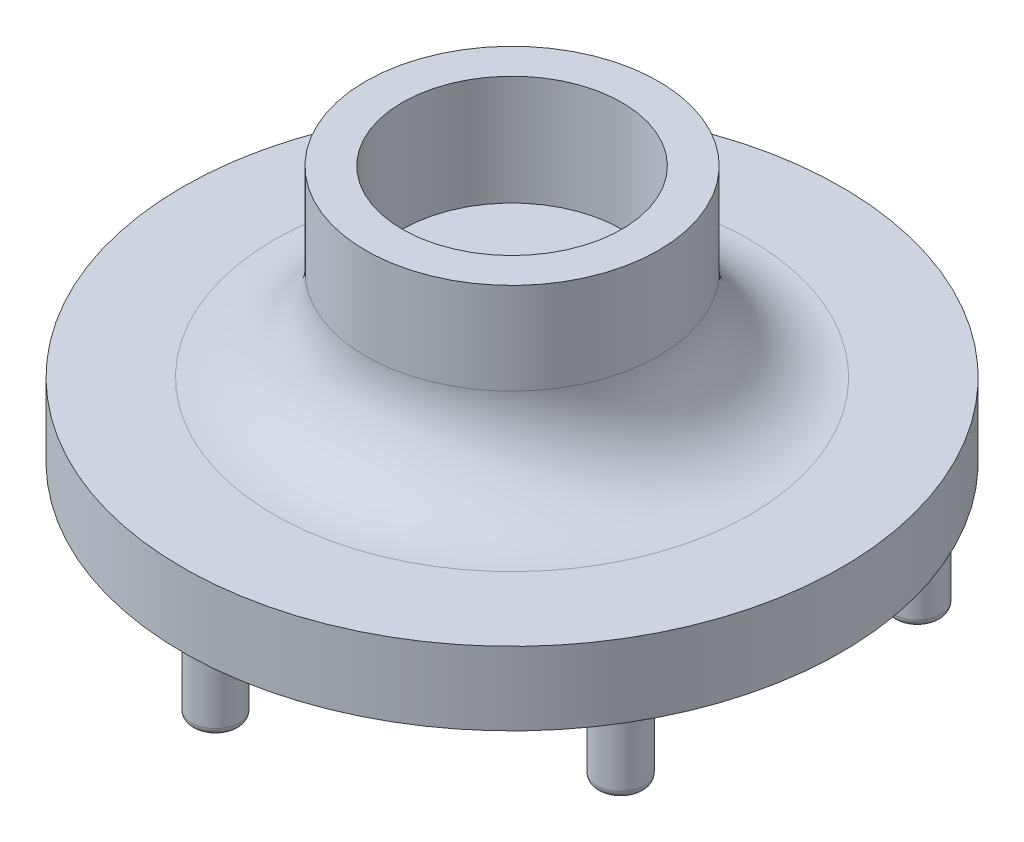
ISO-10303-21;
HEADER;
FILE_DESCRIPTION(('STEP AP214'),'2;1');
FILE_NAME('part.step','',(''),(''),'','','');
FILE_SCHEMA(('AUTOMOTIVE_DESIGN { 1 0 10303 214 1 1 1 1 }'));
ENDSEC;
DATA;
#1=APPLICATION_CONTEXT('core data for automotive mechanical design processes');
#2=APPLICATION_PROTOCOL_DEFINITION('international standard','automotive_design',2000,#1);
#3=PRODUCT_CONTEXT('',#1,'mechanical');
#4=PRODUCT('Part','Part','',(#3));
#5=PRODUCT_RELATED_PRODUCT_CATEGORY('part','',(#4));
#6=PRODUCT_DEFINITION_FORMATION('','',#4);
#7=PRODUCT_DEFINITION_CONTEXT('part definition',#1,'design');
#8=PRODUCT_DEFINITION('design','',#6,#7);
#9=PRODUCT_DEFINITION_SHAPE('','',#8);
#10=(LENGTH_UNIT() NAMED_UNIT(*) SI_UNIT(.MILLI.,.METRE.));
#11=(NAMED_UNIT(*) PLANE_ANGLE_UNIT() SI_UNIT($,.RADIAN.));
#12=(NAMED_UNIT(*) SI_UNIT($,.STERADIAN.) SOLID_ANGLE_UNIT());
#13=UNCERTAINTY_MEASURE_WITH_UNIT(LENGTH_MEASURE(1.E-05),#10,'distance_accuracy_value','');
#14=(GEOMETRIC_REPRESENTATION_CONTEXT(3) GLOBAL_UNCERTAINTY_ASSIGNED_CONTEXT((#13)) GLOBAL_UNIT_ASSIGNED_CONTEXT((#10,
#11,#12)) REPRESENTATION_CONTEXT('',''));
#15=CARTESIAN_POINT('',(0.,0.,0.));
#16=DIRECTION('',(0.,0.,1.));
#17=DIRECTION('',(1.,0.,0.));
#18=AXIS2_PLACEMENT_3D('',#15,#16,#17);
#19=CARTESIAN_POINT('',(0.,0.,0.));
#20=DIRECTION('',(0.,1.,0.));
#21=DIRECTION('',(-1.,0.,0.));
#22=AXIS2_PLACEMENT_3D('',#19,#20,#21);
#23=PLANE('',#22);
#24=CARTESIAN_POINT('',(0.,0.,0.));
#25=DIRECTION('',(0.,1.,0.));
#26=DIRECTION('',(-1.,0.,0.));
#27=AXIS2_PLACEMENT_3D('',#24,#25,#26);
#28=CIRCLE('',#27,16.1432512575363);
#29=CARTESIAN_POINT('',(-16.1432512575363,0.,0.));
#30=VERTEX_POINT('',#29);
#31=EDGE_CURVE('E99',#30,#30,#28,.F.);
#32=ORIENTED_EDGE('',*,*,#31,.T.);
#33=EDGE_LOOP('',(#32));
#34=FACE_BOUND('',#33,.T.);
#35=ADVANCED_FACE('F43',(#34),#23,.F.);
#36=CARTESIAN_POINT('',(0.,75.,0.));
#37=DIRECTION('',(0.,1.,0.));
#38=DIRECTION('',(-1.,0.,0.));
#39=AXIS2_PLACEMENT_3D('',#36,#37,#38);
#40=CYLINDRICAL_SURFACE('',#39,50.);
#41=CARTESIAN_POINT('',(0.,35.,0.));
#42=DIRECTION('',(0.,1.,0.));
#43=DIRECTION('',(-1.,0.,0.));
#44=AXIS2_PLACEMENT_3D('',#41,#42,#43);
#45=CIRCLE('',#44,50.);
#46=CARTESIAN_POINT('',(-50.,35.,0.));
#47=VERTEX_POINT('',#46);
#48=EDGE_CURVE('E135',#47,#47,#45,.T.);
#49=ORIENTED_EDGE('',*,*,#48,.F.);
#50=EDGE_LOOP('',(#49));
#51=FACE_BOUND('',#50,.T.);
#52=CARTESIAN_POINT('',(0.,30.,0.));
#53=DIRECTION('',(0.,1.,0.));
#54=DIRECTION('',(-1.,0.,0.));
#55=AXIS2_PLACEMENT_3D('',#52,#53,#54);
#56=CIRCLE('',#55,50.);
#57=CARTESIAN_POINT('',(-50.,30.,0.));
#58=VERTEX_POINT('',#57);
#59=EDGE_CURVE('E139',#58,#58,#56,.T.);
#60=ORIENTED_EDGE('',*,*,#59,.T.);
#61=EDGE_LOOP('',(#60));
#62=FACE_BOUND('',#61,.T.);
#63=ADVANCED_FACE('F186',(#51,#62),#40,.T.);
#64=CARTESIAN_POINT('',(0.,35.,0.));
#65=DIRECTION('',(0.,1.,0.));
#66=DIRECTION('',(-1.,0.,0.));
#67=AXIS2_PLACEMENT_3D('',#64,#65,#66);
#68=PLANE('',#67);
#69=CARTESIAN_POINT('',(70.1480577065391,35.,-40.5000000000008));
#70=DIRECTION('',(0.,1.,0.));
#71=DIRECTION('',(-1.,0.,0.));
#72=AXIS2_PLACEMENT_3D('',#69,#70,#71);
#73=CIRCLE('',#72,6.5);
#74=CARTESIAN_POINT('',(63.6480577065391,35.,-40.5000000000008));
#75=VERTEX_POINT('',#74);
#76=EDGE_CURVE('E163',#75,#75,#73,.T.);
#77=ORIENTED_EDGE('',*,*,#76,.T.);
#78=EDGE_LOOP('',(#77));
#79=FACE_BOUND('',#78,.T.);
#80=CARTESIAN_POINT('',(70.1480577065399,35.,40.4999999999993));
#81=DIRECTION('',(0.,1.,0.));
#82=DIRECTION('',(-1.,0.,0.));
#83=AXIS2_PLACEMENT_3D('',#80,#81,#82);
#84=CIRCLE('',#83,6.5);
#85=CARTESIAN_POINT('',(63.6480577065399,35.,40.4999999999993));
#86=VERTEX_POINT('',#85);
#87=EDGE_CURVE('E159',#86,#86,#84,.T.);
#88=ORIENTED_EDGE('',*,*,#87,.T.);
#89=EDGE_LOOP('',(#88));
#90=FACE_BOUND('',#89,.T.);
#91=CARTESIAN_POINT('',(0.,35.,81.));
#92=DIRECTION('',(0.,1.,0.));
#93=DIRECTION('',(-1.,0.,0.));
#94=AXIS2_PLACEMENT_3D('',#91,#92,#93);
#95=CIRCLE('',#94,6.5);
#96=CARTESIAN_POINT('',(-6.5,35.,81.));
#97=VERTEX_POINT('',#96);
#98=EDGE_CURVE('E155',#97,#97,#95,.T.);
#99=ORIENTED_EDGE('',*,*,#98,.T.);
#100=EDGE_LOOP('',(#99));
#101=FACE_BOUND('',#100,.T.);
#102=CARTESIAN_POINT('',(-70.1480577065393,35.,40.5000000000003));
#103=DIRECTION('',(0.,1.,0.));
#104=DIRECTION('',(-1.,0.,0.));
#105=AXIS2_PLACEMENT_3D('',#102,#103,#104);
#106=CIRCLE('',#105,6.5);
#107=CARTESIAN_POINT('',(-76.6480577065394,35.,40.5000000000003));
#108=VERTEX_POINT('',#107);
#109=EDGE_CURVE('E151',#108,#108,#106,.T.);
#110=ORIENTED_EDGE('',*,*,#109,.T.);
#111=EDGE_LOOP('',(#110));
#112=FACE_BOUND('',#111,.T.);
#113=CARTESIAN_POINT('',(-70.1480577065396,35.,-40.4999999999998));
#114=DIRECTION('',(0.,1.,0.));
#115=DIRECTION('',(-1.,0.,0.));
#116=AXIS2_PLACEMENT_3D('',#113,#114,#115);
#117=CIRCLE('',#116,6.5);
#118=CARTESIAN_POINT('',(-76.6480577065396,35.,-40.4999999999998));
#119=VERTEX_POINT('',#118);
#120=EDGE_CURVE('E147',#119,#119,#117,.T.);
#121=ORIENTED_EDGE('',*,*,#120,.T.);
#122=EDGE_LOOP('',(#121));
#123=FACE_BOUND('',#122,.T.);
#124=CARTESIAN_POINT('',(0.,35.,-81.));
#125=DIRECTION('',(0.,1.,0.));
#126=DIRECTION('',(-1.,0.,0.));
#127=AXIS2_PLACEMENT_3D('',#124,#125,#126);
#128=CIRCLE('',#127,6.5);
#129=CARTESIAN_POINT('',(-6.5,35.,-81.));
#130=VERTEX_POINT('',#129);
#131=EDGE_CURVE('E143',#130,#130,#128,.T.);
#132=ORIENTED_EDGE('',*,*,#131,.T.);
#133=EDGE_LOOP('',(#132));
#134=FACE_BOUND('',#133,.T.);
#135=CARTESIAN_POINT('',(0.,35.,0.));
#136=DIRECTION('',(0.,1.,0.));
#137=DIRECTION('',(-1.,0.,0.));
#138=AXIS2_PLACEMENT_3D('',#135,#136,#137);
#139=CIRCLE('',#138,90.);
#140=CARTESIAN_POINT('',(-90.,35.,0.));
#141=VERTEX_POINT('',#140);
#142=EDGE_CURVE('E131',#141,#141,#139,.T.);
#143=ORIENTED_EDGE('',*,*,#142,.F.);
#144=EDGE_LOOP('',(#143));
#145=FACE_BOUND('',#144,.T.);
#146=ORIENTED_EDGE('',*,*,#48,.T.);
#147=EDGE_LOOP('',(#146));
#148=FACE_BOUND('',#147,.T.);
#149=ADVANCED_FACE('F168',(#79,#90,#101,#112,#123,#134,#145,#148),#68,.F.);
#150=CARTESIAN_POINT('',(0.,75.,0.));
#151=DIRECTION('',(0.,1.,0.));
#152=DIRECTION('',(-1.,0.,0.));
#153=AXIS2_PLACEMENT_3D('',#150,#151,#152);
#154=CYLINDRICAL_SURFACE('',#153,90.);
#155=CARTESIAN_POINT('',(0.,55.,0.));
#156=DIRECTION('',(0.,1.,0.));
#157=DIRECTION('',(-1.,0.,0.));
#158=AXIS2_PLACEMENT_3D('',#155,#156,#157);
#159=CIRCLE('',#158,90.);
#160=CARTESIAN_POINT('',(-90.,55.,0.));
#161=VERTEX_POINT('',#160);
#162=EDGE_CURVE('E127',#161,#161,#159,.T.);
#163=ORIENTED_EDGE('',*,*,#162,.F.);
#164=EDGE_LOOP('',(#163));
#165=FACE_BOUND('',#164,.T.);
#166=ORIENTED_EDGE('',*,*,#142,.T.);
#167=EDGE_LOOP('',(#166));
#168=FACE_BOUND('',#167,.T.);
#169=ADVANCED_FACE('F200',(#165,#168),#154,.T.);
#170=CARTESIAN_POINT('',(0.,55.,0.));
#171=DIRECTION('',(0.,-1.,0.));
#172=DIRECTION('',(1.,0.,0.));
#173=AXIS2_PLACEMENT_3D('',#170,#171,#172);
#174=PLANE('',#173);
#175=CARTESIAN_POINT('',(0.,55.,0.));
#176=DIRECTION('',(0.,-1.,0.));
#177=DIRECTION('',(1.,0.,0.));
#178=AXIS2_PLACEMENT_3D('',#175,#176,#177);
#179=CIRCLE('',#178,65.);
#180=CARTESIAN_POINT('',(65.,55.,0.));
#181=VERTEX_POINT('',#180);
#182=EDGE_CURVE('E107',#181,#181,#179,.T.);
#183=ORIENTED_EDGE('',*,*,#182,.T.);
#184=EDGE_LOOP('',(#183));
#185=FACE_BOUND('',#184,.T.);
#186=ORIENTED_EDGE('',*,*,#162,.T.);
#187=EDGE_LOOP('',(#186));
#188=FACE_BOUND('',#187,.T.);
#189=ADVANCED_FACE('F203',(#185,#188),#174,.F.);
#190=CARTESIAN_POINT('',(0.,75.,0.));
#191=DIRECTION('',(0.,1.,0.));
#192=DIRECTION('',(-1.,0.,0.));
#193=AXIS2_PLACEMENT_3D('',#190,#191,#192);
#194=CYLINDRICAL_SURFACE('',#193,40.);
#195=CARTESIAN_POINT('',(0.,80.,0.));
#196=DIRECTION('',(0.,-1.,0.));
#197=DIRECTION('',(1.,0.,0.));
#198=AXIS2_PLACEMENT_3D('',#195,#196,#197);
#199=CIRCLE('',#198,40.);
#200=CARTESIAN_POINT('',(40.,80.,0.));
#201=VERTEX_POINT('',#200);
#202=EDGE_CURVE('E111',#201,#201,#199,.F.);
#203=ORIENTED_EDGE('',*,*,#202,.T.);
#204=EDGE_LOOP('',(#203));
#205=FACE_BOUND('',#204,.T.);
#206=CARTESIAN_POINT('',(0.,105.,0.));
#207=DIRECTION('',(0.,1.,0.));
#208=DIRECTION('',(-1.,0.,0.));
#209=AXIS2_PLACEMENT_3D('',#206,#207,#208);
#210=CIRCLE('',#209,40.);
#211=CARTESIAN_POINT('',(-40.,105.,0.));
#212=VERTEX_POINT('',#211);
#213=EDGE_CURVE('E123',#212,#212,#210,.T.);
#214=ORIENTED_EDGE('',*,*,#213,.F.);
#215=EDGE_LOOP('',(#214));
#216=FACE_BOUND('',#215,.T.);
#217=ADVANCED_FACE('F207',(#205,#216),#194,.T.);
#218=CARTESIAN_POINT('',(0.,105.,0.));
#219=DIRECTION('',(0.,-1.,0.));
#220=DIRECTION('',(1.,0.,0.));
#221=AXIS2_PLACEMENT_3D('',#218,#219,#220);
#222=PLANE('',#221);
#223=CARTESIAN_POINT('',(0.,105.,0.));
#224=DIRECTION('',(0.,1.,0.));
#225=DIRECTION('',(-1.,0.,0.));
#226=AXIS2_PLACEMENT_3D('',#223,#224,#225);
#227=CIRCLE('',#226,30.);
#228=CARTESIAN_POINT('',(-30.,105.,0.));
#229=VERTEX_POINT('',#228);
#230=EDGE_CURVE('E119',#229,#229,#227,.T.);
#231=ORIENTED_EDGE('',*,*,#230,.F.);
#232=EDGE_LOOP('',(#231));
#233=FACE_BOUND('',#232,.T.);
#234=ORIENTED_EDGE('',*,*,#213,.T.);
#235=EDGE_LOOP('',(#234));
#236=FACE_BOUND('',#235,.T.);
#237=ADVANCED_FACE('F211',(#233,#236),#222,.F.);
#238=CARTESIAN_POINT('',(0.,75.,0.));
#239=DIRECTION('',(0.,1.,0.));
#240=DIRECTION('',(-1.,0.,0.));
#241=AXIS2_PLACEMENT_3D('',#238,#239,#240);
#242=CYLINDRICAL_SURFACE('',#241,30.);
#243=CARTESIAN_POINT('',(0.,75.,0.));
#244=DIRECTION('',(0.,1.,0.));
#245=DIRECTION('',(-1.,0.,0.));
#246=AXIS2_PLACEMENT_3D('',#243,#244,#245);
#247=CIRCLE('',#246,30.);
#248=CARTESIAN_POINT('',(-30.,75.,0.));
#249=VERTEX_POINT('',#248);
#250=EDGE_CURVE('E115',#249,#249,#247,.T.);
#251=ORIENTED_EDGE('',*,*,#250,.F.);
#252=EDGE_LOOP('',(#251));
#253=FACE_BOUND('',#252,.T.);
#254=ORIENTED_EDGE('',*,*,#230,.T.);
#255=EDGE_LOOP('',(#254));
#256=FACE_BOUND('',#255,.T.);
#257=ADVANCED_FACE('F215',(#253,#256),#242,.F.);
#258=CARTESIAN_POINT('',(0.,75.,0.));
#259=DIRECTION('',(0.,-1.,0.));
#260=DIRECTION('',(1.,0.,0.));
#261=AXIS2_PLACEMENT_3D('',#258,#259,#260);
#262=PLANE('',#261);
#263=ORIENTED_EDGE('',*,*,#250,.T.);
#264=EDGE_LOOP('',(#263));
#265=FACE_BOUND('',#264,.T.);
#266=ADVANCED_FACE('F219',(#265),#262,.F.);
#267=CARTESIAN_POINT('',(0.,15.,-81.));
#268=DIRECTION('',(0.,1.,0.));
#269=DIRECTION('',(-1.,0.,0.));
#270=AXIS2_PLACEMENT_3D('',#267,#268,#269);
#271=CYLINDRICAL_SURFACE('',#270,6.5);
#272=CARTESIAN_POINT('',(0.,17.,-81.));
#273=DIRECTION('',(0.,1.,0.));
#274=DIRECTION('',(-1.,0.,0.));
#275=AXIS2_PLACEMENT_3D('',#272,#273,#274);
#276=CIRCLE('',#275,6.5);
#277=CARTESIAN_POINT('',(-6.5,17.,-81.));
#278=VERTEX_POINT('',#277);
#279=EDGE_CURVE('E61',#278,#278,#276,.T.);
#280=ORIENTED_EDGE('',*,*,#279,.T.);
#281=EDGE_LOOP('',(#280));
#282=FACE_BOUND('',#281,.T.);
#283=ORIENTED_EDGE('',*,*,#131,.F.);
#284=EDGE_LOOP('',(#283));
#285=FACE_BOUND('',#284,.T.);
#286=ADVANCED_FACE('F195',(#282,#285),#271,.T.);
#287=CARTESIAN_POINT('',(0.,15.,-81.));
#288=DIRECTION('',(0.,1.,0.));
#289=DIRECTION('',(-1.,0.,0.));
#290=AXIS2_PLACEMENT_3D('',#287,#288,#289);
#291=PLANE('',#290);
#292=CARTESIAN_POINT('',(0.,15.,-81.));
#293=DIRECTION('',(0.,1.,0.));
#294=DIRECTION('',(-1.,0.,0.));
#295=AXIS2_PLACEMENT_3D('',#292,#293,#294);
#296=CIRCLE('',#295,4.5);
#297=CARTESIAN_POINT('',(-4.5,15.,-81.));
#298=VERTEX_POINT('',#297);
#299=EDGE_CURVE('E56',#298,#298,#296,.F.);
#300=ORIENTED_EDGE('',*,*,#299,.T.);
#301=EDGE_LOOP('',(#300));
#302=FACE_BOUND('',#301,.T.);
#303=ADVANCED_FACE('F263',(#302),#291,.F.);
#304=CARTESIAN_POINT('',(-70.1480577065396,15.,-40.4999999999998));
#305=DIRECTION('',(0.,1.,0.));
#306=DIRECTION('',(-1.,0.,0.));
#307=AXIS2_PLACEMENT_3D('',#304,#305,#306);
#308=CYLINDRICAL_SURFACE('',#307,6.5);
#309=CARTESIAN_POINT('',(-70.1480577065396,17.,-40.4999999999998));
#310=DIRECTION('',(0.,1.,0.));
#311=DIRECTION('',(-1.,0.,0.));
#312=AXIS2_PLACEMENT_3D('',#309,#310,#311);
#313=CIRCLE('',#312,6.5);
#314=CARTESIAN_POINT('',(-76.6480577065396,17.,-40.4999999999998));
#315=VERTEX_POINT('',#314);
#316=EDGE_CURVE('E71',#315,#315,#313,.T.);
#317=ORIENTED_EDGE('',*,*,#316,.T.);
#318=EDGE_LOOP('',(#317));
#319=FACE_BOUND('',#318,.T.);
#320=ORIENTED_EDGE('',*,*,#120,.F.);
#321=EDGE_LOOP('',(#320));
#322=FACE_BOUND('',#321,.T.);
#323=ADVANCED_FACE('F277',(#319,#322),#308,.T.);
#324=CARTESIAN_POINT('',(-70.1480577065396,15.,-40.4999999999998));
#325=DIRECTION('',(0.,1.,0.));
#326=DIRECTION('',(-0.499999999999998,0.,0.86602540378444));
#327=AXIS2_PLACEMENT_3D('',#324,#325,#326);
#328=PLANE('',#327);
#329=CARTESIAN_POINT('',(-70.1480577065396,15.,-40.4999999999998));
#330=DIRECTION('',(0.,1.,0.));
#331=DIRECTION('',(-1.,0.,0.));
#332=AXIS2_PLACEMENT_3D('',#329,#330,#331);
#333=CIRCLE('',#332,4.5);
#334=CARTESIAN_POINT('',(-74.6480577065396,15.,-40.4999999999998));
#335=VERTEX_POINT('',#334);
#336=EDGE_CURVE('E67',#335,#335,#333,.F.);
#337=ORIENTED_EDGE('',*,*,#336,.T.);
#338=EDGE_LOOP('',(#337));
#339=FACE_BOUND('',#338,.T.);
#340=ADVANCED_FACE('F282',(#339),#328,.F.);
#341=CARTESIAN_POINT('',(-70.1480577065393,15.,40.5000000000003));
#342=DIRECTION('',(0.,1.,0.));
#343=DIRECTION('',(-1.,0.,0.));
#344=AXIS2_PLACEMENT_3D('',#341,#342,#343);
#345=CYLINDRICAL_SURFACE('',#344,6.5);
#346=CARTESIAN_POINT('',(-70.1480577065393,17.,40.5000000000003));
#347=DIRECTION('',(0.,1.,0.));
#348=DIRECTION('',(-1.,0.,0.));
#349=AXIS2_PLACEMENT_3D('',#346,#347,#348);
#350=CIRCLE('',#349,6.5);
#351=CARTESIAN_POINT('',(-76.6480577065394,17.,40.5000000000003));
#352=VERTEX_POINT('',#351);
#353=EDGE_CURVE('E79',#352,#352,#350,.T.);
#354=ORIENTED_EDGE('',*,*,#353,.T.);
#355=EDGE_LOOP('',(#354));
#356=FACE_BOUND('',#355,.T.);
#357=ORIENTED_EDGE('',*,*,#109,.F.);
#358=EDGE_LOOP('',(#357));
#359=FACE_BOUND('',#358,.T.);
#360=ADVANCED_FACE('F288',(#356,#359),#345,.T.);
#361=CARTESIAN_POINT('',(-70.1480577065393,15.,40.5000000000003));
#362=DIRECTION('',(0.,1.,0.));
#363=DIRECTION('',(0.500000000000004,0.,0.866025403784436));
#364=AXIS2_PLACEMENT_3D('',#361,#362,#363);
#365=PLANE('',#364);
#366=CARTESIAN_POINT('',(-70.1480577065393,15.,40.5000000000003));
#367=DIRECTION('',(0.,1.,0.));
#368=DIRECTION('',(-1.,0.,0.));
#369=AXIS2_PLACEMENT_3D('',#366,#367,#368);
#370=CIRCLE('',#369,4.5);
#371=CARTESIAN_POINT('',(-74.6480577065394,15.,40.5000000000003));
#372=VERTEX_POINT('',#371);
#373=EDGE_CURVE('E75',#372,#372,#370,.F.);
#374=ORIENTED_EDGE('',*,*,#373,.T.);
#375=EDGE_LOOP('',(#374));
#376=FACE_BOUND('',#375,.T.);
#377=ADVANCED_FACE('F292',(#376),#365,.F.);
#378=CARTESIAN_POINT('',(0.,15.,81.));
#379=DIRECTION('',(0.,1.,0.));
#380=DIRECTION('',(-1.,0.,0.));
#381=AXIS2_PLACEMENT_3D('',#378,#379,#380);
#382=CYLINDRICAL_SURFACE('',#381,6.5);
#383=CARTESIAN_POINT('',(0.,17.,81.));
#384=DIRECTION('',(0.,1.,0.));
#385=DIRECTION('',(-1.,0.,0.));
#386=AXIS2_PLACEMENT_3D('',#383,#384,#385);
#387=CIRCLE('',#386,6.5);
#388=CARTESIAN_POINT('',(-6.5,17.,81.));
#389=VERTEX_POINT('',#388);
#390=EDGE_CURVE('E87',#389,#389,#387,.T.);
#391=ORIENTED_EDGE('',*,*,#390,.T.);
#392=EDGE_LOOP('',(#391));
#393=FACE_BOUND('',#392,.T.);
#394=ORIENTED_EDGE('',*,*,#98,.F.);
#395=EDGE_LOOP('',(#394));
#396=FACE_BOUND('',#395,.T.);
#397=ADVANCED_FACE('F296',(#393,#396),#382,.T.);
#398=CARTESIAN_POINT('',(0.,15.,81.));
#399=DIRECTION('',(0.,1.,0.));
#400=DIRECTION('',(1.,0.,0.));
#401=AXIS2_PLACEMENT_3D('',#398,#399,#400);
#402=PLANE('',#401);
#403=CARTESIAN_POINT('',(0.,15.,81.));
#404=DIRECTION('',(0.,1.,0.));
#405=DIRECTION('',(-1.,0.,0.));
#406=AXIS2_PLACEMENT_3D('',#403,#404,#405);
#407=CIRCLE('',#406,4.5);
#408=CARTESIAN_POINT('',(-4.5,15.,81.));
#409=VERTEX_POINT('',#408);
#410=EDGE_CURVE('E83',#409,#409,#407,.F.);
#411=ORIENTED_EDGE('',*,*,#410,.T.);
#412=EDGE_LOOP('',(#411));
#413=FACE_BOUND('',#412,.T.);
#414=ADVANCED_FACE('F300',(#413),#402,.F.);
#415=CARTESIAN_POINT('',(70.1480577065399,15.,40.4999999999993));
#416=DIRECTION('',(0.,1.,0.));
#417=DIRECTION('',(-1.,0.,0.));
#418=AXIS2_PLACEMENT_3D('',#415,#416,#417);
#419=CYLINDRICAL_SURFACE('',#418,6.5);
#420=CARTESIAN_POINT('',(70.1480577065399,17.,40.4999999999993));
#421=DIRECTION('',(0.,1.,0.));
#422=DIRECTION('',(-1.,0.,0.));
#423=AXIS2_PLACEMENT_3D('',#420,#421,#422);
#424=CIRCLE('',#423,6.5);
#425=CARTESIAN_POINT('',(63.6480577065399,17.,40.4999999999993));
#426=VERTEX_POINT('',#425);
#427=EDGE_CURVE('E95',#426,#426,#424,.T.);
#428=ORIENTED_EDGE('',*,*,#427,.T.);
#429=EDGE_LOOP('',(#428));
#430=FACE_BOUND('',#429,.T.);
#431=ORIENTED_EDGE('',*,*,#87,.F.);
#432=EDGE_LOOP('',(#431));
#433=FACE_BOUND('',#432,.T.);
#434=ADVANCED_FACE('F182',(#430,#433),#419,.T.);
#435=CARTESIAN_POINT('',(70.1480577065399,15.,40.4999999999993));
#436=DIRECTION('',(0.,1.,0.));
#437=DIRECTION('',(0.499999999999992,0.,-0.866025403784443));
#438=AXIS2_PLACEMENT_3D('',#435,#436,#437);
#439=PLANE('',#438);
#440=CARTESIAN_POINT('',(70.1480577065399,15.,40.4999999999993));
#441=DIRECTION('',(0.,1.,0.));
#442=DIRECTION('',(-1.,0.,0.));
#443=AXIS2_PLACEMENT_3D('',#440,#441,#442);
#444=CIRCLE('',#443,4.5);
#445=CARTESIAN_POINT('',(65.6480577065399,15.,40.4999999999993));
#446=VERTEX_POINT('',#445);
#447=EDGE_CURVE('E91',#446,#446,#444,.F.);
#448=ORIENTED_EDGE('',*,*,#447,.T.);
#449=EDGE_LOOP('',(#448));
#450=FACE_BOUND('',#449,.T.);
#451=ADVANCED_FACE('F174',(#450),#439,.F.);
#452=CARTESIAN_POINT('',(70.1480577065391,15.,-40.5000000000008));
#453=DIRECTION('',(0.,1.,0.));
#454=DIRECTION('',(-1.,0.,0.));
#455=AXIS2_PLACEMENT_3D('',#452,#453,#454);
#456=CYLINDRICAL_SURFACE('',#455,6.5);
#457=CARTESIAN_POINT('',(70.1480577065391,17.,-40.5000000000008));
#458=DIRECTION('',(0.,1.,0.));
#459=DIRECTION('',(-1.,0.,0.));
#460=AXIS2_PLACEMENT_3D('',#457,#458,#459);
#461=CIRCLE('',#460,6.5);
#462=CARTESIAN_POINT('',(63.6480577065391,17.,-40.5000000000008));
#463=VERTEX_POINT('',#462);
#464=EDGE_CURVE('E51',#463,#463,#461,.T.);
#465=ORIENTED_EDGE('',*,*,#464,.T.);
#466=EDGE_LOOP('',(#465));
#467=FACE_BOUND('',#466,.T.);
#468=ORIENTED_EDGE('',*,*,#76,.F.);
#469=EDGE_LOOP('',(#468));
#470=FACE_BOUND('',#469,.T.);
#471=ADVANCED_FACE('F171',(#467,#470),#456,.T.);
#472=CARTESIAN_POINT('',(70.1480577065391,15.,-40.5000000000008));
#473=DIRECTION('',(0.,1.,0.));
#474=DIRECTION('',(-0.50000000000001,0.,-0.866025403784433));
#475=AXIS2_PLACEMENT_3D('',#472,#473,#474);
#476=PLANE('',#475);
#477=CARTESIAN_POINT('',(70.1480577065391,15.,-40.5000000000008));
#478=DIRECTION('',(0.,1.,0.));
#479=DIRECTION('',(-1.,0.,0.));
#480=AXIS2_PLACEMENT_3D('',#477,#478,#479);
#481=CIRCLE('',#480,4.5);
#482=CARTESIAN_POINT('',(65.6480577065391,15.,-40.5000000000008));
#483=VERTEX_POINT('',#482);
#484=EDGE_CURVE('E10',#483,#483,#481,.F.);
#485=ORIENTED_EDGE('',*,*,#484,.T.);
#486=EDGE_LOOP('',(#485));
#487=FACE_BOUND('',#486,.T.);
#488=ADVANCED_FACE('F173',(#487),#476,.F.);
#489=CARTESIAN_POINT('',(0.,80.,0.));
#490=DIRECTION('',(0.,-1.,0.));
#491=DIRECTION('',(1.,0.,0.));
#492=AXIS2_PLACEMENT_3D('',#489,#490,#491);
#493=TOROIDAL_SURFACE('',#492,65.,25.);
#494=ORIENTED_EDGE('',*,*,#182,.F.);
#495=EDGE_LOOP('',(#494));
#496=FACE_BOUND('',#495,.T.);
#497=ORIENTED_EDGE('',*,*,#202,.F.);
#498=EDGE_LOOP('',(#497));
#499=FACE_BOUND('',#498,.T.);
#500=ADVANCED_FACE('F180',(#496,#499),#493,.F.);
#501=CARTESIAN_POINT('',(0.,5.5051025721682,0.));
#502=DIRECTION('',(0.,1.,0.));
#503=DIRECTION('',(-1.,0.,0.));
#504=AXIS2_PLACEMENT_3D('',#501,#502,#503);
#505=TOROIDAL_SURFACE('',#504,55.,25.);
#506=CARTESIAN_POINT('',(0.,11.4394134645631,0.));
#507=DIRECTION('',(0.,-1.,0.));
#508=DIRECTION('',(1.,0.,0.));
#509=AXIS2_PLACEMENT_3D('',#506,#507,#508);
#510=CIRCLE('',#509,30.7145320359602);
#511=CARTESIAN_POINT('',(30.7145320359602,11.4394134645631,0.));
#512=VERTEX_POINT('',#511);
#513=EDGE_CURVE('E103',#512,#512,#510,.F.);
#514=ORIENTED_EDGE('',*,*,#513,.T.);
#515=EDGE_LOOP('',(#514));
#516=FACE_BOUND('',#515,.T.);
#517=ORIENTED_EDGE('',*,*,#59,.F.);
#518=EDGE_LOOP('',(#517));
#519=FACE_BOUND('',#518,.T.);
#520=ADVANCED_FACE('F226',(#516,#519),#505,.F.);
#521=CARTESIAN_POINT('',(0.,15.,0.));
#522=DIRECTION('',(0.,-1.,0.));
#523=DIRECTION('',(1.,0.,0.));
#524=AXIS2_PLACEMENT_3D('',#521,#522,#523);
#525=TOROIDAL_SURFACE('',#524,16.1432512575363,15.);
#526=ORIENTED_EDGE('',*,*,#31,.F.);
#527=EDGE_LOOP('',(#526));
#528=FACE_BOUND('',#527,.T.);
#529=ORIENTED_EDGE('',*,*,#513,.F.);
#530=EDGE_LOOP('',(#529));
#531=FACE_BOUND('',#530,.T.);
#532=ADVANCED_FACE('F230',(#528,#531),#525,.T.);
#533=CARTESIAN_POINT('',(70.1480577065399,17.,40.4999999999993));
#534=DIRECTION('',(0.,1.,0.));
#535=DIRECTION('',(-1.,0.,0.));
#536=AXIS2_PLACEMENT_3D('',#533,#534,#535);
#537=TOROIDAL_SURFACE('',#536,4.5,2.);
#538=ORIENTED_EDGE('',*,*,#447,.F.);
#539=EDGE_LOOP('',(#538));
#540=FACE_BOUND('',#539,.T.);
#541=ORIENTED_EDGE('',*,*,#427,.F.);
#542=EDGE_LOOP('',(#541));
#543=FACE_BOUND('',#542,.T.);
#544=ADVANCED_FACE('F234',(#540,#543),#537,.T.);
#545=CARTESIAN_POINT('',(0.,17.,81.));
#546=DIRECTION('',(0.,1.,0.));
#547=DIRECTION('',(-1.,0.,0.));
#548=AXIS2_PLACEMENT_3D('',#545,#546,#547);
#549=TOROIDAL_SURFACE('',#548,4.5,2.);
#550=ORIENTED_EDGE('',*,*,#410,.F.);
#551=EDGE_LOOP('',(#550));
#552=FACE_BOUND('',#551,.T.);
#553=ORIENTED_EDGE('',*,*,#390,.F.);
#554=EDGE_LOOP('',(#553));
#555=FACE_BOUND('',#554,.T.);
#556=ADVANCED_FACE('F238',(#552,#555),#549,.T.);
#557=CARTESIAN_POINT('',(-70.1480577065393,17.,40.5000000000003));
#558=DIRECTION('',(0.,1.,0.));
#559=DIRECTION('',(-1.,0.,0.));
#560=AXIS2_PLACEMENT_3D('',#557,#558,#559);
#561=TOROIDAL_SURFACE('',#560,4.5,2.);
#562=ORIENTED_EDGE('',*,*,#373,.F.);
#563=EDGE_LOOP('',(#562));
#564=FACE_BOUND('',#563,.T.);
#565=ORIENTED_EDGE('',*,*,#353,.F.);
#566=EDGE_LOOP('',(#565));
#567=FACE_BOUND('',#566,.T.);
#568=ADVANCED_FACE('F242',(#564,#567),#561,.T.);
#569=CARTESIAN_POINT('',(-70.1480577065396,17.,-40.4999999999998));
#570=DIRECTION('',(0.,1.,0.));
#571=DIRECTION('',(-1.,0.,0.));
#572=AXIS2_PLACEMENT_3D('',#569,#570,#571);
#573=TOROIDAL_SURFACE('',#572,4.5,2.);
#574=ORIENTED_EDGE('',*,*,#336,.F.);
#575=EDGE_LOOP('',(#574));
#576=FACE_BOUND('',#575,.T.);
#577=ORIENTED_EDGE('',*,*,#316,.F.);
#578=EDGE_LOOP('',(#577));
#579=FACE_BOUND('',#578,.T.);
#580=ADVANCED_FACE('F246',(#576,#579),#573,.T.);
#581=CARTESIAN_POINT('',(0.,17.,-81.));
#582=DIRECTION('',(0.,1.,0.));
#583=DIRECTION('',(-1.,0.,0.));
#584=AXIS2_PLACEMENT_3D('',#581,#582,#583);
#585=TOROIDAL_SURFACE('',#584,4.5,2.);
#586=ORIENTED_EDGE('',*,*,#299,.F.);
#587=EDGE_LOOP('',(#586));
#588=FACE_BOUND('',#587,.T.);
#589=ORIENTED_EDGE('',*,*,#279,.F.);
#590=EDGE_LOOP('',(#589));
#591=FACE_BOUND('',#590,.T.);
#592=ADVANCED_FACE('F249',(#588,#591),#585,.T.);
#593=CARTESIAN_POINT('',(70.1480577065391,17.,-40.5000000000008));
#594=DIRECTION('',(0.,1.,0.));
#595=DIRECTION('',(-1.,0.,0.));
#596=AXIS2_PLACEMENT_3D('',#593,#594,#595);
#597=TOROIDAL_SURFACE('',#596,4.5,2.);
#598=ORIENTED_EDGE('',*,*,#484,.F.);
#599=EDGE_LOOP('',(#598));
#600=FACE_BOUND('',#599,.T.);
#601=ORIENTED_EDGE('',*,*,#464,.F.);
#602=EDGE_LOOP('',(#601));
#603=FACE_BOUND('',#602,.T.);
#604=ADVANCED_FACE('F45',(#600,#603),#597,.T.);
#605=CLOSED_SHELL('',(#35,#63,#149,#169,#189,#217,#237,#257,#266,#286,#303,#323,#340,#360,#377,
#397,#414,#434,#451,#471,#488,#500,#520,#532,#544,#556,#568,#580,#592,#604));
#606=MANIFOLD_SOLID_BREP('B2',#605);
#607=ADVANCED_BREP_SHAPE_REPRESENTATION('',(#18,#606),#14);
#608=SHAPE_DEFINITION_REPRESENTATION(#9,#607);
ENDSEC;
END-ISO-10303-21;
